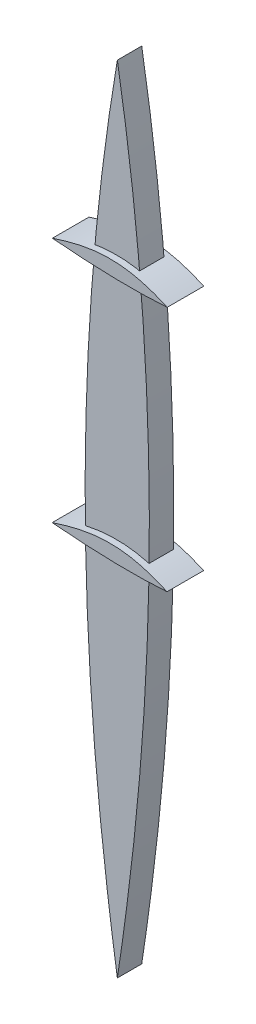
ISO-10303-21;
HEADER;
FILE_DESCRIPTION(('STEP AP214'),'2;1');
FILE_NAME('part.step','',(''),(''),'','','');
FILE_SCHEMA(('AUTOMOTIVE_DESIGN { 1 0 10303 214 1 1 1 1 }'));
ENDSEC;
DATA;
#1=APPLICATION_CONTEXT('core data for automotive mechanical design processes');
#2=APPLICATION_PROTOCOL_DEFINITION('international standard','automotive_design',2000,#1);
#3=PRODUCT_CONTEXT('',#1,'mechanical');
#4=PRODUCT('Part','Part','',(#3));
#5=PRODUCT_RELATED_PRODUCT_CATEGORY('part','',(#4));
#6=PRODUCT_DEFINITION_FORMATION('','',#4);
#7=PRODUCT_DEFINITION_CONTEXT('part definition',#1,'design');
#8=PRODUCT_DEFINITION('design','',#6,#7);
#9=PRODUCT_DEFINITION_SHAPE('','',#8);
#10=(LENGTH_UNIT() NAMED_UNIT(*) SI_UNIT(.MILLI.,.METRE.));
#11=(NAMED_UNIT(*) PLANE_ANGLE_UNIT() SI_UNIT($,.RADIAN.));
#12=(NAMED_UNIT(*) SI_UNIT($,.STERADIAN.) SOLID_ANGLE_UNIT());
#13=UNCERTAINTY_MEASURE_WITH_UNIT(LENGTH_MEASURE(1.E-05),#10,'distance_accuracy_value','');
#14=(GEOMETRIC_REPRESENTATION_CONTEXT(3) GLOBAL_UNCERTAINTY_ASSIGNED_CONTEXT((#13)) GLOBAL_UNIT_ASSIGNED_CONTEXT((#10,
#11,#12)) REPRESENTATION_CONTEXT('',''));
#15=CARTESIAN_POINT('',(0.,0.,0.));
#16=DIRECTION('',(0.,0.,1.));
#17=DIRECTION('',(1.,0.,0.));
#18=AXIS2_PLACEMENT_3D('',#15,#16,#17);
#19=CARTESIAN_POINT('',(-97.3496863798767,356.778039927701,32.3851895718087));
#20=CARTESIAN_POINT('',(13.8440276581281,347.121380184959,32.3851895718087));
#21=CARTESIAN_POINT('',(94.0794827367868,352.801766385218,32.3851895718087));
#22=B_SPLINE_CURVE_WITH_KNOTS('',2,(#19,#20,#21),.UNSPECIFIED.,.F.,.F.,(3,3),(0.,1.),.UNSPECIFIED.);
#23=DIRECTION('',(0.,0.,-1.));
#24=VECTOR('',#23,1.);
#25=SURFACE_OF_LINEAR_EXTRUSION('',#22,#24);
#26=CARTESIAN_POINT('',(-97.3496863798767,356.778039927701,-28.5748104281912));
#27=CARTESIAN_POINT('',(13.8440276581281,347.121380184959,-28.5748104281912));
#28=CARTESIAN_POINT('',(94.0794827367868,352.801766385218,-28.5748104281912));
#29=B_SPLINE_CURVE_WITH_KNOTS('',2,(#26,#27,#28),.UNSPECIFIED.,.F.,.F.,(3,3),(0.,1.),.UNSPECIFIED.);
#30=CARTESIAN_POINT('',(-97.3496863798767,356.778039927701,-28.5748104281912));
#31=VERTEX_POINT('',#30);
#32=CARTESIAN_POINT('',(94.0794827367869,352.801766385217,-28.5748104281912));
#33=VERTEX_POINT('',#32);
#34=EDGE_CURVE('E81',#31,#33,#29,.T.);
#35=ORIENTED_EDGE('',*,*,#34,.T.);
#36=DIRECTION('',(0.,0.,-1.));
#37=VECTOR('',#36,1.);
#38=CARTESIAN_POINT('',(94.0794827367869,352.801766385217,32.3851895718087));
#39=LINE('',#38,#37);
#40=CARTESIAN_POINT('',(94.0794827367869,352.801766385217,32.3851895718087));
#41=VERTEX_POINT('',#40);
#42=EDGE_CURVE('E12',#41,#33,#39,.T.);
#43=ORIENTED_EDGE('',*,*,#42,.F.);
#44=CARTESIAN_POINT('',(-97.3496863798767,356.778039927701,32.3851895718087));
#45=VERTEX_POINT('',#44);
#46=EDGE_CURVE('E80',#45,#41,#22,.T.);
#47=ORIENTED_EDGE('',*,*,#46,.F.);
#48=DIRECTION('',(0.,0.,-1.));
#49=VECTOR('',#48,1.);
#50=CARTESIAN_POINT('',(-97.3496863798767,356.778039927701,32.3851895718087));
#51=LINE('',#50,#49);
#52=EDGE_CURVE('E58',#45,#31,#51,.T.);
#53=ORIENTED_EDGE('',*,*,#52,.T.);
#54=EDGE_LOOP('',(#35,#43,#47,#53));
#55=FACE_BOUND('',#54,.T.);
#56=ADVANCED_FACE('F49',(#55),#25,.F.);
#57=CARTESIAN_POINT('',(94.0794827367869,352.801766385217,32.3851895718087));
#58=CARTESIAN_POINT('',(26.6253605821185,383.333632202592,32.3851895718087));
#59=CARTESIAN_POINT('',(-25.6350800104095,380.919590586729,32.3851895718087));
#60=CARTESIAN_POINT('',(-97.3496863798767,356.778039927701,32.3851895718087));
#61=B_SPLINE_CURVE_WITH_KNOTS('',3,(#57,#58,#59,#60),.UNSPECIFIED.,.F.,.F.,(4,4),(0.,1.),.UNSPECIFIED.);
#62=DIRECTION('',(0.,0.,-1.));
#63=VECTOR('',#62,1.);
#64=SURFACE_OF_LINEAR_EXTRUSION('',#61,#63);
#65=CARTESIAN_POINT('',(94.0794827367869,352.801766385217,-28.5748104281912));
#66=CARTESIAN_POINT('',(26.6253605821185,383.333632202592,-28.5748104281912));
#67=CARTESIAN_POINT('',(-25.6350800104095,380.919590586729,-28.5748104281912));
#68=CARTESIAN_POINT('',(-97.3496863798767,356.778039927701,-28.5748104281912));
#69=B_SPLINE_CURVE_WITH_KNOTS('',3,(#65,#66,#67,#68),.UNSPECIFIED.,.F.,.F.,(4,4),(0.,1.),.UNSPECIFIED.);
#70=EDGE_CURVE('E73',#33,#31,#69,.T.);
#71=ORIENTED_EDGE('',*,*,#70,.T.);
#72=ORIENTED_EDGE('',*,*,#52,.F.);
#73=EDGE_CURVE('E65',#41,#45,#61,.T.);
#74=ORIENTED_EDGE('',*,*,#73,.F.);
#75=ORIENTED_EDGE('',*,*,#42,.T.);
#76=EDGE_LOOP('',(#71,#72,#74,#75));
#77=FACE_BOUND('',#76,.T.);
#78=ADVANCED_FACE('F76',(#77),#64,.F.);
#79=CARTESIAN_POINT('',(6.1044629182916,350.955641670708,32.3851895718087));
#80=DIRECTION('',(0.,0.,-1.));
#81=DIRECTION('',(-1.,0.,0.));
#82=AXIS2_PLACEMENT_3D('',#79,#80,#81);
#83=PLANE('',#82);
#84=ORIENTED_EDGE('',*,*,#46,.T.);
#85=ORIENTED_EDGE('',*,*,#73,.T.);
#86=EDGE_LOOP('',(#84,#85));
#87=FACE_BOUND('',#86,.T.);
#88=ADVANCED_FACE('F108',(#87),#83,.F.);
#89=CARTESIAN_POINT('',(6.1044629182916,350.955641670708,-28.5748104281912));
#90=DIRECTION('',(0.,0.,-1.));
#91=DIRECTION('',(-1.,0.,0.));
#92=AXIS2_PLACEMENT_3D('',#89,#90,#91);
#93=PLANE('',#92);
#94=ORIENTED_EDGE('',*,*,#34,.F.);
#95=ORIENTED_EDGE('',*,*,#70,.F.);
#96=EDGE_LOOP('',(#94,#95));
#97=FACE_BOUND('',#96,.T.);
#98=ADVANCED_FACE('F84',(#97),#93,.T.);
#99=CLOSED_SHELL('',(#56,#78,#88,#98));
#100=MANIFOLD_SOLID_BREP('B2',#99);
#101=CARTESIAN_POINT('',(-97.6606054144443,-53.7775151283095,-28.5748104349544));
#102=CARTESIAN_POINT('',(13.5331086235605,-63.4341748710512,-28.5748104349544));
#103=CARTESIAN_POINT('',(93.7685637022192,-57.7537886707921,-28.5748104349544));
#104=B_SPLINE_CURVE_WITH_KNOTS('',2,(#101,#102,#103),.UNSPECIFIED.,.F.,.F.,(3,3),(0.,1.),.UNSPECIFIED.);
#105=DIRECTION('',(0.,0.,1.));
#106=VECTOR('',#105,1.);
#107=SURFACE_OF_LINEAR_EXTRUSION('',#104,#106);
#108=DIRECTION('',(0.,0.,1.));
#109=VECTOR('',#108,1.);
#110=CARTESIAN_POINT('',(93.7685637022193,-57.7537886707921,-28.5748104349544));
#111=LINE('',#110,#109);
#112=CARTESIAN_POINT('',(93.7685637022193,-57.7537886707921,-28.5748104349544));
#113=VERTEX_POINT('',#112);
#114=CARTESIAN_POINT('',(93.7685637022193,-57.7537886707921,32.3851895650456));
#115=VERTEX_POINT('',#114);
#116=EDGE_CURVE('E163',#113,#115,#111,.T.);
#117=ORIENTED_EDGE('',*,*,#116,.T.);
#118=CARTESIAN_POINT('',(-97.6606054144443,-53.7775151283095,32.3851895650456));
#119=CARTESIAN_POINT('',(13.5331086235605,-63.4341748710512,32.3851895650456));
#120=CARTESIAN_POINT('',(93.7685637022192,-57.7537886707921,32.3851895650456));
#121=B_SPLINE_CURVE_WITH_KNOTS('',2,(#118,#119,#120),.UNSPECIFIED.,.F.,.F.,(3,3),(0.,1.),.UNSPECIFIED.);
#122=CARTESIAN_POINT('',(-97.6606054144443,-53.7775151283095,32.3851895650456));
#123=VERTEX_POINT('',#122);
#124=EDGE_CURVE('E184',#123,#115,#121,.T.);
#125=ORIENTED_EDGE('',*,*,#124,.F.);
#126=DIRECTION('',(0.,0.,1.));
#127=VECTOR('',#126,1.);
#128=CARTESIAN_POINT('',(-97.6606054144443,-53.7775151283095,-28.5748104349544));
#129=LINE('',#128,#127);
#130=CARTESIAN_POINT('',(-97.6606054144443,-53.7775151283095,-28.5748104349544));
#131=VERTEX_POINT('',#130);
#132=EDGE_CURVE('E47',#131,#123,#129,.T.);
#133=ORIENTED_EDGE('',*,*,#132,.F.);
#134=EDGE_CURVE('E185',#131,#113,#104,.T.);
#135=ORIENTED_EDGE('',*,*,#134,.T.);
#136=EDGE_LOOP('',(#117,#125,#133,#135));
#137=FACE_BOUND('',#136,.T.);
#138=ADVANCED_FACE('F159',(#137),#107,.T.);
#139=CARTESIAN_POINT('',(93.7685637022193,-57.7537886707921,-28.5748104349544));
#140=CARTESIAN_POINT('',(26.3144415475509,-27.221922853416,-28.5748104349544));
#141=CARTESIAN_POINT('',(-25.945999044977,-29.6359644692809,-28.5748104349544));
#142=CARTESIAN_POINT('',(-97.6606054144443,-53.7775151283095,-28.5748104349544));
#143=B_SPLINE_CURVE_WITH_KNOTS('',3,(#139,#140,#141,#142),.UNSPECIFIED.,.F.,.F.,(4,4),(0.,1.),.UNSPECIFIED.);
#144=DIRECTION('',(0.,0.,1.));
#145=VECTOR('',#144,1.);
#146=SURFACE_OF_LINEAR_EXTRUSION('',#143,#145);
#147=ORIENTED_EDGE('',*,*,#132,.T.);
#148=CARTESIAN_POINT('',(93.7685637022193,-57.7537886707921,32.3851895650456));
#149=CARTESIAN_POINT('',(26.3144415475509,-27.221922853416,32.3851895650456));
#150=CARTESIAN_POINT('',(-25.945999044977,-29.6359644692809,32.3851895650456));
#151=CARTESIAN_POINT('',(-97.6606054144443,-53.7775151283095,32.3851895650456));
#152=B_SPLINE_CURVE_WITH_KNOTS('',3,(#148,#149,#150,#151),.UNSPECIFIED.,.F.,.F.,(4,4),(0.,1.),.UNSPECIFIED.);
#153=EDGE_CURVE('E189',#115,#123,#152,.T.);
#154=ORIENTED_EDGE('',*,*,#153,.F.);
#155=ORIENTED_EDGE('',*,*,#116,.F.);
#156=EDGE_CURVE('E187',#113,#131,#143,.T.);
#157=ORIENTED_EDGE('',*,*,#156,.T.);
#158=EDGE_LOOP('',(#147,#154,#155,#157));
#159=FACE_BOUND('',#158,.T.);
#160=ADVANCED_FACE('F190',(#159),#146,.T.);
#161=CARTESIAN_POINT('',(5.79354388372399,-59.5999133853009,-28.5748104349544));
#162=DIRECTION('',(0.,0.,-1.));
#163=DIRECTION('',(-1.,0.,0.));
#164=AXIS2_PLACEMENT_3D('',#161,#162,#163);
#165=PLANE('',#164);
#166=ORIENTED_EDGE('',*,*,#134,.F.);
#167=ORIENTED_EDGE('',*,*,#156,.F.);
#168=EDGE_LOOP('',(#166,#167));
#169=FACE_BOUND('',#168,.T.);
#170=ADVANCED_FACE('F220',(#169),#165,.T.);
#171=CARTESIAN_POINT('',(5.79354388372399,-59.5999133853009,32.3851895650456));
#172=DIRECTION('',(0.,0.,-1.));
#173=DIRECTION('',(-1.,0.,0.));
#174=AXIS2_PLACEMENT_3D('',#171,#172,#173);
#175=PLANE('',#174);
#176=ORIENTED_EDGE('',*,*,#124,.T.);
#177=ORIENTED_EDGE('',*,*,#153,.T.);
#178=EDGE_LOOP('',(#176,#177));
#179=FACE_BOUND('',#178,.T.);
#180=ADVANCED_FACE('F193',(#179),#175,.F.);
#181=CLOSED_SHELL('',(#138,#160,#170,#180));
#182=MANIFOLD_SOLID_BREP('B6',#181);
#183=CARTESIAN_POINT('',(0.150569384693463,657.176741399961,21.59));
#184=CARTESIAN_POINT('',(-107.278427592037,26.6185986358411,21.59));
#185=CARTESIAN_POINT('',(0.150569384693678,-667.368395535644,21.59));
#186=B_SPLINE_CURVE_WITH_KNOTS('',2,(#183,#184,#185),.UNSPECIFIED.,.F.,.F.,(3,3),(0.,1.),.UNSPECIFIED.);
#187=DIRECTION('',(0.,0.,-1.));
#188=VECTOR('',#187,1.);
#189=SURFACE_OF_LINEAR_EXTRUSION('',#186,#188);
#190=CARTESIAN_POINT('',(0.150569384693463,657.176741399961,-19.05));
#191=CARTESIAN_POINT('',(-107.278427592037,26.6185986358411,-19.05));
#192=CARTESIAN_POINT('',(0.150569384693678,-667.368395535644,-19.05));
#193=B_SPLINE_CURVE_WITH_KNOTS('',2,(#190,#191,#192),.UNSPECIFIED.,.F.,.F.,(3,3),(0.,1.),.UNSPECIFIED.);
#194=CARTESIAN_POINT('',(0.150569384693463,657.176741399961,-19.05));
#195=VERTEX_POINT('',#194);
#196=CARTESIAN_POINT('',(0.150569384693297,-667.368395535644,-19.05));
#197=VERTEX_POINT('',#196);
#198=EDGE_CURVE('E285',#195,#197,#193,.T.);
#199=ORIENTED_EDGE('',*,*,#198,.T.);
#200=DIRECTION('',(0.,0.,-1.));
#201=VECTOR('',#200,1.);
#202=CARTESIAN_POINT('',(0.150569384693297,-667.368395535644,21.59));
#203=LINE('',#202,#201);
#204=CARTESIAN_POINT('',(0.150569384693297,-667.368395535644,21.59));
#205=VERTEX_POINT('',#204);
#206=EDGE_CURVE('E157',#205,#197,#203,.T.);
#207=ORIENTED_EDGE('',*,*,#206,.F.);
#208=CARTESIAN_POINT('',(0.150569384693463,657.176741399961,21.59));
#209=VERTEX_POINT('',#208);
#210=EDGE_CURVE('E287',#209,#205,#186,.T.);
#211=ORIENTED_EDGE('',*,*,#210,.F.);
#212=DIRECTION('',(0.,0.,-1.));
#213=VECTOR('',#212,1.);
#214=CARTESIAN_POINT('',(0.150569384693463,657.176741399961,21.59));
#215=LINE('',#214,#213);
#216=EDGE_CURVE('E269',#209,#195,#215,.T.);
#217=ORIENTED_EDGE('',*,*,#216,.T.);
#218=EDGE_LOOP('',(#199,#207,#211,#217));
#219=FACE_BOUND('',#218,.T.);
#220=ADVANCED_FACE('F260',(#219),#189,.F.);
#221=CARTESIAN_POINT('',(0.150569384693463,657.176741399961,21.59));
#222=CARTESIAN_POINT('',(106.776717214568,28.6634027982596,21.59));
#223=CARTESIAN_POINT('',(0.150569384693297,-667.368395535644,21.59));
#224=B_SPLINE_CURVE_WITH_KNOTS('',2,(#221,#222,#223),.UNSPECIFIED.,.F.,.F.,(3,3),(0.,1.),.UNSPECIFIED.);
#225=DIRECTION('',(0.,0.,-1.));
#226=VECTOR('',#225,1.);
#227=SURFACE_OF_LINEAR_EXTRUSION('',#224,#226);
#228=CARTESIAN_POINT('',(0.150569384693463,657.176741399961,-19.05));
#229=CARTESIAN_POINT('',(106.776717214568,28.6634027982596,-19.05));
#230=CARTESIAN_POINT('',(0.150569384693297,-667.368395535644,-19.05));
#231=B_SPLINE_CURVE_WITH_KNOTS('',2,(#228,#229,#230),.UNSPECIFIED.,.F.,.F.,(3,3),(0.,1.),.UNSPECIFIED.);
#232=EDGE_CURVE('E292',#195,#197,#231,.T.);
#233=ORIENTED_EDGE('',*,*,#232,.F.);
#234=ORIENTED_EDGE('',*,*,#216,.F.);
#235=EDGE_CURVE('E289',#209,#205,#224,.T.);
#236=ORIENTED_EDGE('',*,*,#235,.T.);
#237=ORIENTED_EDGE('',*,*,#206,.T.);
#238=EDGE_LOOP('',(#233,#234,#236,#237));
#239=FACE_BOUND('',#238,.T.);
#240=ADVANCED_FACE('F294',(#239),#227,.T.);
#241=CARTESIAN_POINT('',(-53.5639291036716,10.7613857839996,21.59));
#242=DIRECTION('',(0.,0.,-1.));
#243=DIRECTION('',(-1.,0.,0.));
#244=AXIS2_PLACEMENT_3D('',#241,#242,#243);
#245=PLANE('',#244);
#246=ORIENTED_EDGE('',*,*,#210,.T.);
#247=ORIENTED_EDGE('',*,*,#235,.F.);
#248=EDGE_LOOP('',(#246,#247));
#249=FACE_BOUND('',#248,.T.);
#250=ADVANCED_FACE('F318',(#249),#245,.F.);
#251=CARTESIAN_POINT('',(-53.5639291036716,10.7613857839996,-19.05));
#252=DIRECTION('',(0.,0.,-1.));
#253=DIRECTION('',(-1.,0.,0.));
#254=AXIS2_PLACEMENT_3D('',#251,#252,#253);
#255=PLANE('',#254);
#256=ORIENTED_EDGE('',*,*,#198,.F.);
#257=ORIENTED_EDGE('',*,*,#232,.T.);
#258=EDGE_LOOP('',(#256,#257));
#259=FACE_BOUND('',#258,.T.);
#260=ADVANCED_FACE('F291',(#259),#255,.T.);
#261=CLOSED_SHELL('',(#220,#240,#250,#260));
#262=MANIFOLD_SOLID_BREP('B41',#261);
#263=ADVANCED_BREP_SHAPE_REPRESENTATION('',(#18,#100,#182,#262),#14);
#264=SHAPE_DEFINITION_REPRESENTATION(#9,#263);
ENDSEC;
END-ISO-10303-21;
